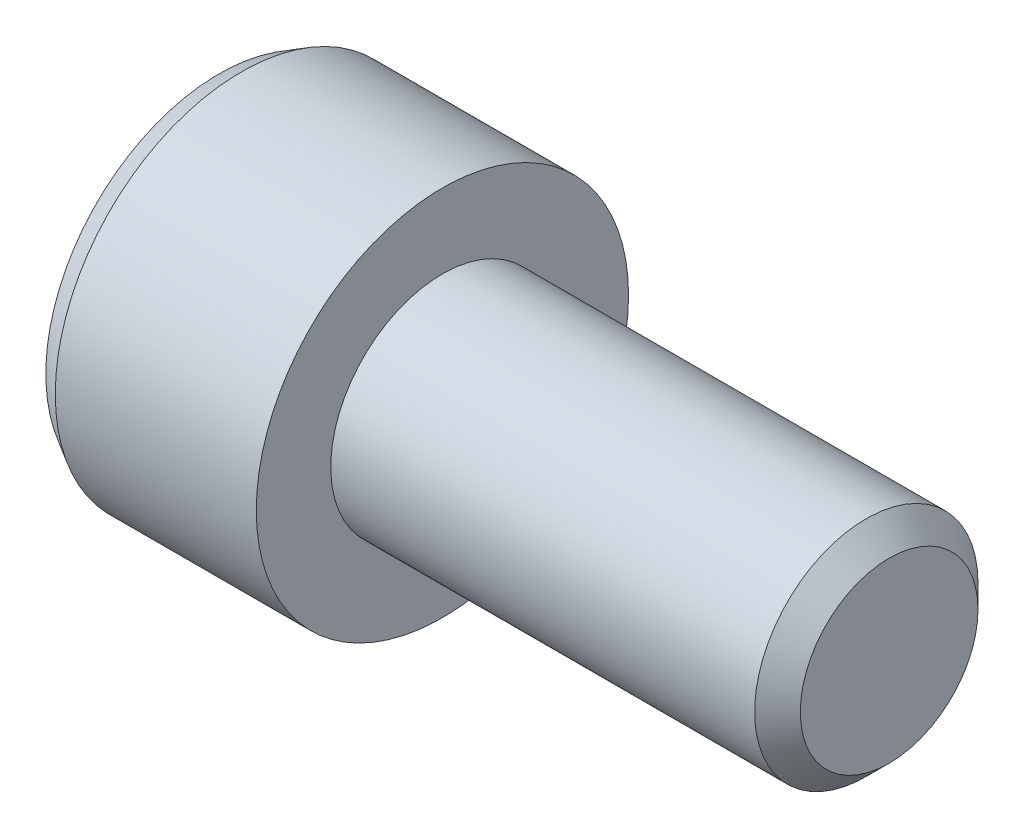
ISO-10303-21;
HEADER;
FILE_DESCRIPTION(('STEP AP214'),'2;1');
FILE_NAME('part.step','',(''),(''),'','','');
FILE_SCHEMA(('AUTOMOTIVE_DESIGN { 1 0 10303 214 1 1 1 1 }'));
ENDSEC;
DATA;
#1=APPLICATION_CONTEXT('core data for automotive mechanical design processes');
#2=APPLICATION_PROTOCOL_DEFINITION('international standard','automotive_design',2000,#1);
#3=PRODUCT_CONTEXT('',#1,'mechanical');
#4=PRODUCT('Part','Part','',(#3));
#5=PRODUCT_RELATED_PRODUCT_CATEGORY('part','',(#4));
#6=PRODUCT_DEFINITION_FORMATION('','',#4);
#7=PRODUCT_DEFINITION_CONTEXT('part definition',#1,'design');
#8=PRODUCT_DEFINITION('design','',#6,#7);
#9=PRODUCT_DEFINITION_SHAPE('','',#8);
#10=(LENGTH_UNIT() NAMED_UNIT(*) SI_UNIT(.MILLI.,.METRE.));
#11=(NAMED_UNIT(*) PLANE_ANGLE_UNIT() SI_UNIT($,.RADIAN.));
#12=(NAMED_UNIT(*) SI_UNIT($,.STERADIAN.) SOLID_ANGLE_UNIT());
#13=UNCERTAINTY_MEASURE_WITH_UNIT(LENGTH_MEASURE(1.E-05),#10,'distance_accuracy_value','');
#14=(GEOMETRIC_REPRESENTATION_CONTEXT(3) GLOBAL_UNCERTAINTY_ASSIGNED_CONTEXT((#13)) GLOBAL_UNIT_ASSIGNED_CONTEXT((#10,
#11,#12)) REPRESENTATION_CONTEXT('',''));
#15=CARTESIAN_POINT('',(0.,0.,0.));
#16=DIRECTION('',(0.,0.,1.));
#17=DIRECTION('',(1.,0.,0.));
#18=AXIS2_PLACEMENT_3D('',#15,#16,#17);
#19=CARTESIAN_POINT('',(-6.,-4.6535898384862,4.6535898384862));
#20=DIRECTION('',(-1.,0.,0.));
#21=DIRECTION('',(0.,1.,0.));
#22=AXIS2_PLACEMENT_3D('',#19,#20,#21);
#23=PLANE('',#22);
#24=CARTESIAN_POINT('',(-6.,0.,0.));
#25=DIRECTION('',(-1.,0.,0.));
#26=DIRECTION('',(0.,0.,-1.));
#27=AXIS2_PLACEMENT_3D('',#24,#25,#26);
#28=CIRCLE('',#27,4.6535898384862);
#29=CARTESIAN_POINT('',(-6.,0.,-4.6535898384862));
#30=VERTEX_POINT('',#29);
#31=EDGE_CURVE('E115',#30,#30,#28,.F.);
#32=ORIENTED_EDGE('',*,*,#31,.F.);
#33=EDGE_LOOP('',(#32));
#34=FACE_BOUND('',#33,.T.);
#35=DIRECTION('',(0.,0.499999999999983,-0.866025403784448));
#36=VECTOR('',#35,1.);
#37=CARTESIAN_POINT('',(-6.,-2.8867513459481,0.));
#38=LINE('',#37,#36);
#39=CARTESIAN_POINT('',(-6.,-2.8867513459481,0.));
#40=VERTEX_POINT('',#39);
#41=CARTESIAN_POINT('',(-6.,-1.4433756729741,-2.5));
#42=VERTEX_POINT('',#41);
#43=EDGE_CURVE('E100',#40,#42,#38,.T.);
#44=ORIENTED_EDGE('',*,*,#43,.T.);
#45=DIRECTION('',(0.,1.,0.));
#46=VECTOR('',#45,1.);
#47=CARTESIAN_POINT('',(-6.,-1.4433756729741,-2.5));
#48=LINE('',#47,#46);
#49=CARTESIAN_POINT('',(-6.,1.4433756729741,-2.5));
#50=VERTEX_POINT('',#49);
#51=EDGE_CURVE('E88',#42,#50,#48,.T.);
#52=ORIENTED_EDGE('',*,*,#51,.T.);
#53=DIRECTION('',(0.,0.499999999999984,0.866025403784448));
#54=VECTOR('',#53,1.);
#55=CARTESIAN_POINT('',(-6.,1.4433756729741,-2.5));
#56=LINE('',#55,#54);
#57=CARTESIAN_POINT('',(-6.,2.8867513459481,0.));
#58=VERTEX_POINT('',#57);
#59=EDGE_CURVE('E99',#50,#58,#56,.T.);
#60=ORIENTED_EDGE('',*,*,#59,.T.);
#61=DIRECTION('',(0.,-0.499999999999983,0.866025403784448));
#62=VECTOR('',#61,1.);
#63=CARTESIAN_POINT('',(-6.,2.8867513459481,0.));
#64=LINE('',#63,#62);
#65=CARTESIAN_POINT('',(-6.,1.4433756729741,2.5));
#66=VERTEX_POINT('',#65);
#67=EDGE_CURVE('E125',#58,#66,#64,.T.);
#68=ORIENTED_EDGE('',*,*,#67,.T.);
#69=DIRECTION('',(0.,-1.,0.));
#70=VECTOR('',#69,1.);
#71=CARTESIAN_POINT('',(-6.,1.4433756729741,2.5));
#72=LINE('',#71,#70);
#73=CARTESIAN_POINT('',(-6.,-1.4433756729741,2.5));
#74=VERTEX_POINT('',#73);
#75=EDGE_CURVE('E130',#66,#74,#72,.T.);
#76=ORIENTED_EDGE('',*,*,#75,.T.);
#77=DIRECTION('',(0.,-0.499999999999983,-0.866025403784448));
#78=VECTOR('',#77,1.);
#79=CARTESIAN_POINT('',(-6.,-1.4433756729741,2.5));
#80=LINE('',#79,#78);
#81=EDGE_CURVE('E114',#74,#40,#80,.T.);
#82=ORIENTED_EDGE('',*,*,#81,.T.);
#83=EDGE_LOOP('',(#44,#52,#60,#68,#76,#82));
#84=FACE_BOUND('',#83,.T.);
#85=ADVANCED_FACE('F16',(#34,#84),#23,.T.);
#86=CARTESIAN_POINT('',(0.,-4.99999975829996,-5.00000000000001));
#87=DIRECTION('',(1.,0.,0.));
#88=DIRECTION('',(0.,1.,0.));
#89=AXIS2_PLACEMENT_3D('',#86,#87,#88);
#90=PLANE('',#89);
#91=CARTESIAN_POINT('',(0.,0.,0.));
#92=DIRECTION('',(1.,0.,0.));
#93=DIRECTION('',(0.,-1.41721898572201E-07,0.99999999999999));
#94=AXIS2_PLACEMENT_3D('',#91,#92,#93);
#95=CIRCLE('',#94,5.);
#96=CARTESIAN_POINT('',(0.,-7.08609492861005E-07,4.99999999999995));
#97=VERTEX_POINT('',#96);
#98=EDGE_CURVE('E137',#97,#97,#95,.T.);
#99=ORIENTED_EDGE('',*,*,#98,.T.);
#100=EDGE_LOOP('',(#99));
#101=FACE_BOUND('',#100,.T.);
#102=CARTESIAN_POINT('',(0.,0.,0.));
#103=DIRECTION('',(-1.,0.,0.));
#104=DIRECTION('',(0.,0.,-1.));
#105=AXIS2_PLACEMENT_3D('',#102,#103,#104);
#106=CIRCLE('',#105,3.);
#107=CARTESIAN_POINT('',(0.,0.,-3.));
#108=VERTEX_POINT('',#107);
#109=EDGE_CURVE('E142',#108,#108,#106,.F.);
#110=ORIENTED_EDGE('',*,*,#109,.F.);
#111=EDGE_LOOP('',(#110));
#112=FACE_BOUND('',#111,.T.);
#113=ADVANCED_FACE('F264',(#101,#112),#90,.T.);
#114=CARTESIAN_POINT('',(12.,-2.3865,-2.3865));
#115=DIRECTION('',(1.,0.,0.));
#116=DIRECTION('',(0.,1.,0.));
#117=AXIS2_PLACEMENT_3D('',#114,#115,#116);
#118=PLANE('',#117);
#119=CARTESIAN_POINT('',(12.,0.,0.));
#120=DIRECTION('',(1.,0.,0.));
#121=DIRECTION('',(0.,0.,1.));
#122=AXIS2_PLACEMENT_3D('',#119,#120,#121);
#123=CIRCLE('',#122,2.3865);
#124=CARTESIAN_POINT('',(12.,0.,2.3865));
#125=VERTEX_POINT('',#124);
#126=EDGE_CURVE('E145',#125,#125,#123,.T.);
#127=ORIENTED_EDGE('',*,*,#126,.T.);
#128=EDGE_LOOP('',(#127));
#129=FACE_BOUND('',#128,.T.);
#130=ADVANCED_FACE('F270',(#129),#118,.T.);
#131=CARTESIAN_POINT('',(-3.,-1.4433756729741,2.5));
#132=DIRECTION('',(0.,0.,-1.));
#133=DIRECTION('',(-1.,0.,0.));
#134=AXIS2_PLACEMENT_3D('',#131,#132,#133);
#135=PLANE('',#134);
#136=ORIENTED_EDGE('',*,*,#75,.F.);
#137=DIRECTION('',(1.,0.,0.));
#138=VECTOR('',#137,1.);
#139=CARTESIAN_POINT('',(-6.,1.4433756729741,2.5));
#140=LINE('',#139,#138);
#141=CARTESIAN_POINT('',(-3.,1.4433756729741,2.5));
#142=VERTEX_POINT('',#141);
#143=EDGE_CURVE('E148',#142,#66,#140,.F.);
#144=ORIENTED_EDGE('',*,*,#143,.F.);
#145=DIRECTION('',(0.,-1.,0.));
#146=VECTOR('',#145,1.);
#147=CARTESIAN_POINT('',(-3.,1.4433756729741,2.5));
#148=LINE('',#147,#146);
#149=CARTESIAN_POINT('',(-3.,0.,2.5));
#150=VERTEX_POINT('',#149);
#151=EDGE_CURVE('E150',#142,#150,#148,.T.);
#152=ORIENTED_EDGE('',*,*,#151,.T.);
#153=DIRECTION('',(0.,-1.,0.));
#154=VECTOR('',#153,1.);
#155=CARTESIAN_POINT('',(-3.,0.,2.5));
#156=LINE('',#155,#154);
#157=CARTESIAN_POINT('',(-3.,-1.4433756729741,2.5));
#158=VERTEX_POINT('',#157);
#159=EDGE_CURVE('E155',#150,#158,#156,.T.);
#160=ORIENTED_EDGE('',*,*,#159,.T.);
#161=DIRECTION('',(-1.,0.,0.));
#162=VECTOR('',#161,1.);
#163=CARTESIAN_POINT('',(-3.,-1.4433756729741,2.5));
#164=LINE('',#163,#162);
#165=EDGE_CURVE('E160',#158,#74,#164,.T.);
#166=ORIENTED_EDGE('',*,*,#165,.T.);
#167=EDGE_LOOP('',(#136,#144,#152,#160,#166));
#168=FACE_BOUND('',#167,.T.);
#169=ADVANCED_FACE('F276',(#168),#135,.T.);
#170=CARTESIAN_POINT('',(-6.,-2.8867513459481,0.));
#171=DIRECTION('',(0.,0.866025403784449,-0.499999999999983));
#172=DIRECTION('',(0.,0.499999999999983,0.866025403784449));
#173=AXIS2_PLACEMENT_3D('',#170,#171,#172);
#174=PLANE('',#173);
#175=ORIENTED_EDGE('',*,*,#81,.F.);
#176=ORIENTED_EDGE('',*,*,#165,.F.);
#177=DIRECTION('',(0.,-0.499999999999983,-0.866025403784449));
#178=VECTOR('',#177,1.);
#179=CARTESIAN_POINT('',(-3.,-1.4433756729741,2.5));
#180=LINE('',#179,#178);
#181=CARTESIAN_POINT('',(-3.,-2.16506350946112,1.24999999999996));
#182=VERTEX_POINT('',#181);
#183=EDGE_CURVE('E165',#158,#182,#180,.T.);
#184=ORIENTED_EDGE('',*,*,#183,.T.);
#185=DIRECTION('',(0.,-0.499999999999983,-0.866025403784449));
#186=VECTOR('',#185,1.);
#187=CARTESIAN_POINT('',(-3.,-2.16506350946112,1.24999999999996));
#188=LINE('',#187,#186);
#189=CARTESIAN_POINT('',(-3.,-2.8867513459481,0.));
#190=VERTEX_POINT('',#189);
#191=EDGE_CURVE('E170',#182,#190,#188,.T.);
#192=ORIENTED_EDGE('',*,*,#191,.T.);
#193=DIRECTION('',(-1.,0.,0.));
#194=VECTOR('',#193,1.);
#195=CARTESIAN_POINT('',(-3.,-2.8867513459481,0.));
#196=LINE('',#195,#194);
#197=EDGE_CURVE('E175',#190,#40,#196,.T.);
#198=ORIENTED_EDGE('',*,*,#197,.T.);
#199=EDGE_LOOP('',(#175,#176,#184,#192,#198));
#200=FACE_BOUND('',#199,.T.);
#201=ADVANCED_FACE('F280',(#200),#174,.T.);
#202=CARTESIAN_POINT('',(-6.,-1.4433756729741,-2.5));
#203=DIRECTION('',(0.,0.866025403784449,0.499999999999983));
#204=DIRECTION('',(0.,-0.499999999999983,0.866025403784449));
#205=AXIS2_PLACEMENT_3D('',#202,#203,#204);
#206=PLANE('',#205);
#207=ORIENTED_EDGE('',*,*,#43,.F.);
#208=ORIENTED_EDGE('',*,*,#197,.F.);
#209=DIRECTION('',(0.,0.499999999999983,-0.866025403784449));
#210=VECTOR('',#209,1.);
#211=CARTESIAN_POINT('',(-3.,-2.8867513459481,0.));
#212=LINE('',#211,#210);
#213=CARTESIAN_POINT('',(-3.,-2.16506350946112,-1.24999999999996));
#214=VERTEX_POINT('',#213);
#215=EDGE_CURVE('E179',#190,#214,#212,.T.);
#216=ORIENTED_EDGE('',*,*,#215,.T.);
#217=DIRECTION('',(0.,0.499999999999983,-0.866025403784449));
#218=VECTOR('',#217,1.);
#219=CARTESIAN_POINT('',(-3.,-2.16506350946112,-1.24999999999996));
#220=LINE('',#219,#218);
#221=CARTESIAN_POINT('',(-3.,-1.4433756729741,-2.5));
#222=VERTEX_POINT('',#221);
#223=EDGE_CURVE('E109',#214,#222,#220,.T.);
#224=ORIENTED_EDGE('',*,*,#223,.T.);
#225=DIRECTION('',(-1.,0.,0.));
#226=VECTOR('',#225,1.);
#227=CARTESIAN_POINT('',(-3.,-1.4433756729741,-2.5));
#228=LINE('',#227,#226);
#229=EDGE_CURVE('E92',#222,#42,#228,.T.);
#230=ORIENTED_EDGE('',*,*,#229,.T.);
#231=EDGE_LOOP('',(#207,#208,#216,#224,#230));
#232=FACE_BOUND('',#231,.T.);
#233=ADVANCED_FACE('F104',(#232),#206,.T.);
#234=CARTESIAN_POINT('',(-6.,-1.4433756729741,-2.5));
#235=DIRECTION('',(0.,0.,1.));
#236=DIRECTION('',(1.,0.,0.));
#237=AXIS2_PLACEMENT_3D('',#234,#235,#236);
#238=PLANE('',#237);
#239=ORIENTED_EDGE('',*,*,#51,.F.);
#240=ORIENTED_EDGE('',*,*,#229,.F.);
#241=DIRECTION('',(0.,1.,0.));
#242=VECTOR('',#241,1.);
#243=CARTESIAN_POINT('',(-3.,-1.4433756729741,-2.5));
#244=LINE('',#243,#242);
#245=CARTESIAN_POINT('',(-3.,0.,-2.5));
#246=VERTEX_POINT('',#245);
#247=EDGE_CURVE('E110',#222,#246,#244,.T.);
#248=ORIENTED_EDGE('',*,*,#247,.T.);
#249=DIRECTION('',(0.,1.,0.));
#250=VECTOR('',#249,1.);
#251=CARTESIAN_POINT('',(-3.,0.,-2.5));
#252=LINE('',#251,#250);
#253=CARTESIAN_POINT('',(-3.,1.4433756729741,-2.5));
#254=VERTEX_POINT('',#253);
#255=EDGE_CURVE('E191',#246,#254,#252,.T.);
#256=ORIENTED_EDGE('',*,*,#255,.T.);
#257=DIRECTION('',(-1.,0.,0.));
#258=VECTOR('',#257,1.);
#259=CARTESIAN_POINT('',(-3.,1.4433756729741,-2.5));
#260=LINE('',#259,#258);
#261=EDGE_CURVE('E95',#254,#50,#260,.T.);
#262=ORIENTED_EDGE('',*,*,#261,.T.);
#263=EDGE_LOOP('',(#239,#240,#248,#256,#262));
#264=FACE_BOUND('',#263,.T.);
#265=ADVANCED_FACE('F90',(#264),#238,.T.);
#266=CARTESIAN_POINT('',(-6.,2.8867513459481,0.));
#267=DIRECTION('',(0.,-0.866025403784449,0.499999999999983));
#268=DIRECTION('',(0.,-0.499999999999983,-0.866025403784449));
#269=AXIS2_PLACEMENT_3D('',#266,#267,#268);
#270=PLANE('',#269);
#271=ORIENTED_EDGE('',*,*,#59,.F.);
#272=ORIENTED_EDGE('',*,*,#261,.F.);
#273=DIRECTION('',(0.,0.499999999999983,0.866025403784449));
#274=VECTOR('',#273,1.);
#275=CARTESIAN_POINT('',(-3.,1.4433756729741,-2.5));
#276=LINE('',#275,#274);
#277=CARTESIAN_POINT('',(-3.,2.16506350946112,-1.24999999999996));
#278=VERTEX_POINT('',#277);
#279=EDGE_CURVE('E198',#254,#278,#276,.T.);
#280=ORIENTED_EDGE('',*,*,#279,.T.);
#281=DIRECTION('',(0.,0.499999999999983,0.866025403784449));
#282=VECTOR('',#281,1.);
#283=CARTESIAN_POINT('',(-3.,2.16506350946112,-1.24999999999996));
#284=LINE('',#283,#282);
#285=CARTESIAN_POINT('',(-3.,2.8867513459481,0.));
#286=VERTEX_POINT('',#285);
#287=EDGE_CURVE('E203',#278,#286,#284,.T.);
#288=ORIENTED_EDGE('',*,*,#287,.T.);
#289=DIRECTION('',(-1.,0.,0.));
#290=VECTOR('',#289,1.);
#291=CARTESIAN_POINT('',(-3.,2.8867513459481,0.));
#292=LINE('',#291,#290);
#293=EDGE_CURVE('E208',#286,#58,#292,.T.);
#294=ORIENTED_EDGE('',*,*,#293,.T.);
#295=EDGE_LOOP('',(#271,#272,#280,#288,#294));
#296=FACE_BOUND('',#295,.T.);
#297=ADVANCED_FACE('F289',(#296),#270,.T.);
#298=CARTESIAN_POINT('',(-6.,1.4433756729741,2.5));
#299=DIRECTION('',(0.,-0.866025403784449,-0.499999999999983));
#300=DIRECTION('',(0.,0.499999999999983,-0.866025403784449));
#301=AXIS2_PLACEMENT_3D('',#298,#299,#300);
#302=PLANE('',#301);
#303=ORIENTED_EDGE('',*,*,#67,.F.);
#304=ORIENTED_EDGE('',*,*,#293,.F.);
#305=DIRECTION('',(0.,-0.499999999999983,0.866025403784449));
#306=VECTOR('',#305,1.);
#307=CARTESIAN_POINT('',(-3.,2.8867513459481,0.));
#308=LINE('',#307,#306);
#309=CARTESIAN_POINT('',(-3.,2.16506350946112,1.24999999999996));
#310=VERTEX_POINT('',#309);
#311=EDGE_CURVE('E213',#286,#310,#308,.T.);
#312=ORIENTED_EDGE('',*,*,#311,.T.);
#313=DIRECTION('',(0.,-0.499999999999983,0.866025403784449));
#314=VECTOR('',#313,1.);
#315=CARTESIAN_POINT('',(-3.,2.16506350946112,1.24999999999996));
#316=LINE('',#315,#314);
#317=EDGE_CURVE('E218',#310,#142,#316,.T.);
#318=ORIENTED_EDGE('',*,*,#317,.T.);
#319=ORIENTED_EDGE('',*,*,#143,.T.);
#320=EDGE_LOOP('',(#303,#304,#312,#318,#319));
#321=FACE_BOUND('',#320,.T.);
#322=ADVANCED_FACE('F292',(#321),#302,.T.);
#323=CARTESIAN_POINT('',(-3.,0.,-1.24999999999996));
#324=DIRECTION('',(-1.,0.,0.));
#325=DIRECTION('',(0.,1.,0.));
#326=AXIS2_PLACEMENT_3D('',#323,#324,#325);
#327=PLANE('',#326);
#328=CARTESIAN_POINT('',(-3.,0.,0.));
#329=DIRECTION('',(1.,0.,0.));
#330=DIRECTION('',(0.,0.,-1.));
#331=AXIS2_PLACEMENT_3D('',#328,#329,#330);
#332=CIRCLE('',#331,2.5);
#333=EDGE_CURVE('E223',#246,#278,#332,.T.);
#334=ORIENTED_EDGE('',*,*,#333,.T.);
#335=ORIENTED_EDGE('',*,*,#279,.F.);
#336=ORIENTED_EDGE('',*,*,#255,.F.);
#337=EDGE_LOOP('',(#334,#335,#336));
#338=FACE_BOUND('',#337,.T.);
#339=ADVANCED_FACE('F296',(#338),#327,.T.);
#340=CARTESIAN_POINT('',(-3.,2.16506350946112,1.24999999999996));
#341=DIRECTION('',(-1.,0.,0.));
#342=DIRECTION('',(0.,1.,0.));
#343=AXIS2_PLACEMENT_3D('',#340,#341,#342);
#344=PLANE('',#343);
#345=ORIENTED_EDGE('',*,*,#287,.F.);
#346=CARTESIAN_POINT('',(-3.,0.,0.));
#347=DIRECTION('',(1.,0.,0.));
#348=DIRECTION('',(0.,0.866025403784448,-0.499999999999983));
#349=AXIS2_PLACEMENT_3D('',#346,#347,#348);
#350=CIRCLE('',#349,2.5);
#351=EDGE_CURVE('E228',#278,#310,#350,.T.);
#352=ORIENTED_EDGE('',*,*,#351,.T.);
#353=ORIENTED_EDGE('',*,*,#311,.F.);
#354=EDGE_LOOP('',(#345,#352,#353));
#355=FACE_BOUND('',#354,.T.);
#356=ADVANCED_FACE('F300',(#355),#344,.T.);
#357=CARTESIAN_POINT('',(-3.,0.,2.5));
#358=DIRECTION('',(-1.,0.,0.));
#359=DIRECTION('',(0.,1.,0.));
#360=AXIS2_PLACEMENT_3D('',#357,#358,#359);
#361=PLANE('',#360);
#362=CARTESIAN_POINT('',(-3.,0.,0.));
#363=DIRECTION('',(1.,0.,0.));
#364=DIRECTION('',(0.,0.866025403784448,0.499999999999983));
#365=AXIS2_PLACEMENT_3D('',#362,#363,#364);
#366=CIRCLE('',#365,2.5);
#367=EDGE_CURVE('E34',#310,#150,#366,.T.);
#368=ORIENTED_EDGE('',*,*,#367,.T.);
#369=ORIENTED_EDGE('',*,*,#151,.F.);
#370=ORIENTED_EDGE('',*,*,#317,.F.);
#371=EDGE_LOOP('',(#368,#369,#370));
#372=FACE_BOUND('',#371,.T.);
#373=ADVANCED_FACE('F304',(#372),#361,.T.);
#374=CARTESIAN_POINT('',(-3.,-2.16506350946112,2.5));
#375=DIRECTION('',(-1.,0.,0.));
#376=DIRECTION('',(0.,1.,0.));
#377=AXIS2_PLACEMENT_3D('',#374,#375,#376);
#378=PLANE('',#377);
#379=CARTESIAN_POINT('',(-3.,0.,0.));
#380=DIRECTION('',(1.,0.,0.));
#381=DIRECTION('',(0.,0.,1.));
#382=AXIS2_PLACEMENT_3D('',#379,#380,#381);
#383=CIRCLE('',#382,2.5);
#384=EDGE_CURVE('E235',#150,#182,#383,.T.);
#385=ORIENTED_EDGE('',*,*,#384,.T.);
#386=ORIENTED_EDGE('',*,*,#183,.F.);
#387=ORIENTED_EDGE('',*,*,#159,.F.);
#388=EDGE_LOOP('',(#385,#386,#387));
#389=FACE_BOUND('',#388,.T.);
#390=ADVANCED_FACE('F308',(#389),#378,.T.);
#391=CARTESIAN_POINT('',(-3.,-2.8867513459481,1.24999999999996));
#392=DIRECTION('',(-1.,0.,0.));
#393=DIRECTION('',(0.,1.,0.));
#394=AXIS2_PLACEMENT_3D('',#391,#392,#393);
#395=PLANE('',#394);
#396=CARTESIAN_POINT('',(-3.,0.,0.));
#397=DIRECTION('',(1.,0.,0.));
#398=DIRECTION('',(0.,-0.866025403784448,0.499999999999983));
#399=AXIS2_PLACEMENT_3D('',#396,#397,#398);
#400=CIRCLE('',#399,2.5);
#401=EDGE_CURVE('E240',#182,#214,#400,.T.);
#402=ORIENTED_EDGE('',*,*,#401,.T.);
#403=ORIENTED_EDGE('',*,*,#215,.F.);
#404=ORIENTED_EDGE('',*,*,#191,.F.);
#405=EDGE_LOOP('',(#402,#403,#404));
#406=FACE_BOUND('',#405,.T.);
#407=ADVANCED_FACE('F312',(#406),#395,.T.);
#408=CARTESIAN_POINT('',(-3.,-2.16506350946112,-1.24999999999996));
#409=DIRECTION('',(-1.,0.,0.));
#410=DIRECTION('',(0.,1.,0.));
#411=AXIS2_PLACEMENT_3D('',#408,#409,#410);
#412=PLANE('',#411);
#413=CARTESIAN_POINT('',(-3.,0.,0.));
#414=DIRECTION('',(1.,0.,0.));
#415=DIRECTION('',(0.,-0.866025403784448,-0.499999999999984));
#416=AXIS2_PLACEMENT_3D('',#413,#414,#415);
#417=CIRCLE('',#416,2.5);
#418=EDGE_CURVE('E245',#214,#246,#417,.T.);
#419=ORIENTED_EDGE('',*,*,#418,.T.);
#420=ORIENTED_EDGE('',*,*,#247,.F.);
#421=ORIENTED_EDGE('',*,*,#223,.F.);
#422=EDGE_LOOP('',(#419,#420,#421));
#423=FACE_BOUND('',#422,.T.);
#424=ADVANCED_FACE('F259',(#423),#412,.T.);
#425=CARTESIAN_POINT('',(-5.4,0.,0.));
#426=DIRECTION('',(1.,0.,0.));
#427=DIRECTION('',(0.,1.92343152856519E-10,1.));
#428=AXIS2_PLACEMENT_3D('',#425,#426,#427);
#429=CONICAL_SURFACE('',#428,5.,0.523598775598327);
#430=CARTESIAN_POINT('',(-5.4,0.,0.));
#431=DIRECTION('',(-1.,0.,0.));
#432=DIRECTION('',(0.,0.,-1.));
#433=AXIS2_PLACEMENT_3D('',#430,#431,#432);
#434=CIRCLE('',#433,5.);
#435=CARTESIAN_POINT('',(-5.4,0.,-5.));
#436=VERTEX_POINT('',#435);
#437=EDGE_CURVE('E24',#436,#436,#434,.F.);
#438=ORIENTED_EDGE('',*,*,#437,.F.);
#439=EDGE_LOOP('',(#438));
#440=FACE_BOUND('',#439,.T.);
#441=ORIENTED_EDGE('',*,*,#31,.T.);
#442=EDGE_LOOP('',(#441));
#443=FACE_BOUND('',#442,.T.);
#444=ADVANCED_FACE('F256',(#440,#443),#429,.T.);
#445=CARTESIAN_POINT('',(12.,0.,0.));
#446=DIRECTION('',(1.,0.,0.));
#447=DIRECTION('',(0.,7.69370911764408E-10,1.));
#448=AXIS2_PLACEMENT_3D('',#445,#446,#447);
#449=CYLINDRICAL_SURFACE('',#448,5.);
#450=ORIENTED_EDGE('',*,*,#98,.F.);
#451=EDGE_LOOP('',(#450));
#452=FACE_BOUND('',#451,.T.);
#453=ORIENTED_EDGE('',*,*,#437,.T.);
#454=EDGE_LOOP('',(#453));
#455=FACE_BOUND('',#454,.T.);
#456=ADVANCED_FACE('F254',(#452,#455),#449,.T.);
#457=CARTESIAN_POINT('',(12.,0.,0.));
#458=DIRECTION('',(1.,0.,0.));
#459=DIRECTION('',(0.,0.,1.));
#460=AXIS2_PLACEMENT_3D('',#457,#458,#459);
#461=CYLINDRICAL_SURFACE('',#460,3.);
#462=CARTESIAN_POINT('',(11.3865,0.,0.));
#463=DIRECTION('',(-1.,0.,0.));
#464=DIRECTION('',(0.,0.,-1.));
#465=AXIS2_PLACEMENT_3D('',#462,#463,#464);
#466=CIRCLE('',#465,3.);
#467=CARTESIAN_POINT('',(11.3865,0.,-3.));
#468=VERTEX_POINT('',#467);
#469=EDGE_CURVE('E11',#468,#468,#466,.F.);
#470=ORIENTED_EDGE('',*,*,#469,.F.);
#471=EDGE_LOOP('',(#470));
#472=FACE_BOUND('',#471,.T.);
#473=ORIENTED_EDGE('',*,*,#109,.T.);
#474=EDGE_LOOP('',(#473));
#475=FACE_BOUND('',#474,.T.);
#476=ADVANCED_FACE('F322',(#472,#475),#461,.T.);
#477=CARTESIAN_POINT('',(11.3865,0.,0.));
#478=DIRECTION('',(-1.,0.,0.));
#479=DIRECTION('',(0.,0.,-1.));
#480=AXIS2_PLACEMENT_3D('',#477,#478,#479);
#481=CONICAL_SURFACE('',#480,3.,0.785398163397449);
#482=ORIENTED_EDGE('',*,*,#126,.F.);
#483=EDGE_LOOP('',(#482));
#484=FACE_BOUND('',#483,.T.);
#485=ORIENTED_EDGE('',*,*,#469,.T.);
#486=EDGE_LOOP('',(#485));
#487=FACE_BOUND('',#486,.T.);
#488=ADVANCED_FACE('F325',(#484,#487),#481,.T.);
#489=CARTESIAN_POINT('',(-3.,0.,0.));
#490=DIRECTION('',(-1.,0.,0.));
#491=DIRECTION('',(0.,0.,-1.));
#492=AXIS2_PLACEMENT_3D('',#489,#490,#491);
#493=CONICAL_SURFACE('',#492,2.5,1.04719755119659);
#494=ORIENTED_EDGE('',*,*,#418,.F.);
#495=ORIENTED_EDGE('',*,*,#401,.F.);
#496=ORIENTED_EDGE('',*,*,#384,.F.);
#497=ORIENTED_EDGE('',*,*,#367,.F.);
#498=ORIENTED_EDGE('',*,*,#351,.F.);
#499=ORIENTED_EDGE('',*,*,#333,.F.);
#500=EDGE_LOOP('',(#494,#495,#496,#497,#498,#499));
#501=FACE_BOUND('',#500,.T.);
#502=CARTESIAN_POINT('',(-1.5566243270259,0.,0.));
#503=VERTEX_POINT('',#502);
#504=VERTEX_LOOP('',#503);
#505=FACE_BOUND('',#504,.T.);
#506=ADVANCED_FACE('F18',(#501,#505),#493,.F.);
#507=CLOSED_SHELL('',(#85,#113,#130,#169,#201,#233,#265,#297,#322,#339,#356,#373,#390,#407,#424,
#444,#456,#476,#488,#506));
#508=MANIFOLD_SOLID_BREP('B1',#507);
#509=ADVANCED_BREP_SHAPE_REPRESENTATION('',(#18,#508),#14);
#510=SHAPE_DEFINITION_REPRESENTATION(#9,#509);
ENDSEC;
END-ISO-10303-21;
